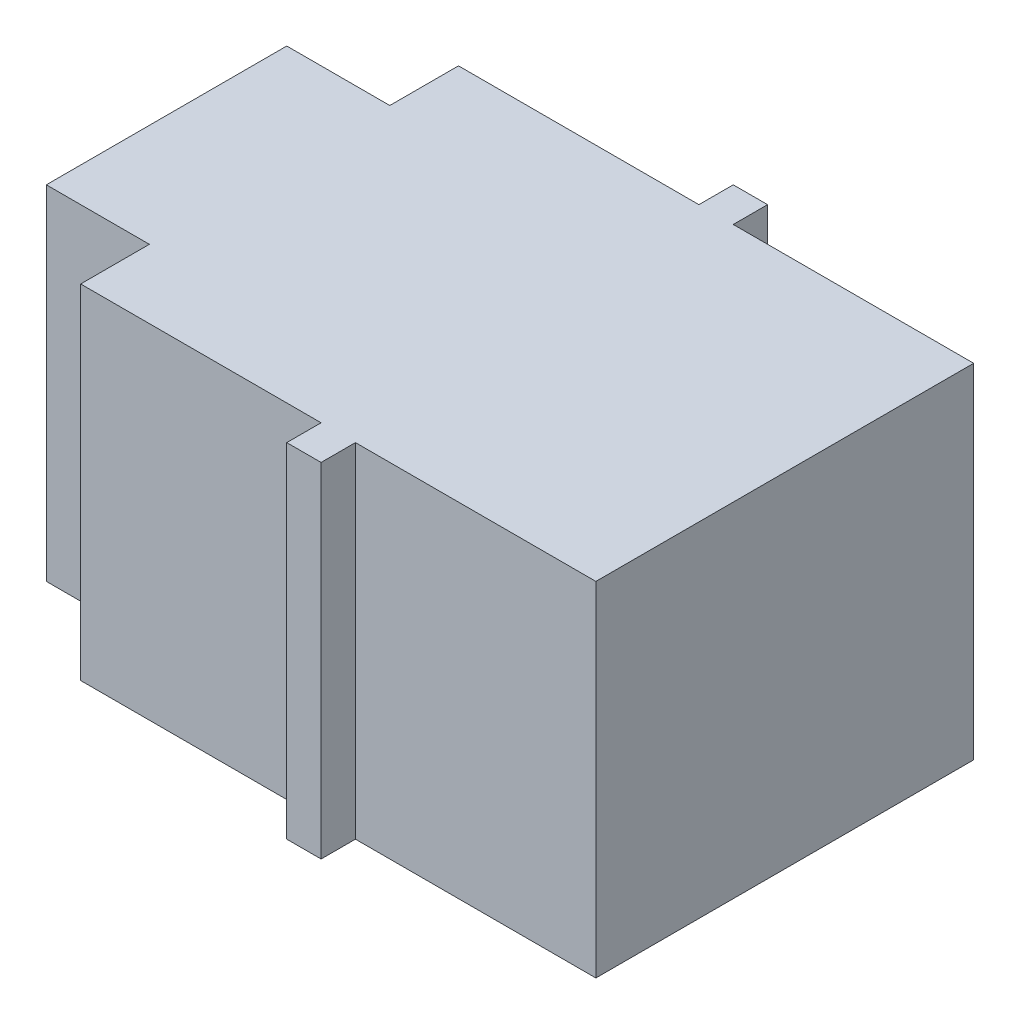
ISO-10303-21;
HEADER;
FILE_DESCRIPTION(('STEP AP214'),'2;1');
FILE_NAME('part.step','',(''),(''),'','','');
FILE_SCHEMA(('AUTOMOTIVE_DESIGN { 1 0 10303 214 1 1 1 1 }'));
ENDSEC;
DATA;
#1=APPLICATION_CONTEXT('core data for automotive mechanical design processes');
#2=APPLICATION_PROTOCOL_DEFINITION('international standard','automotive_design',2000,#1);
#3=PRODUCT_CONTEXT('',#1,'mechanical');
#4=PRODUCT('Part','Part','',(#3));
#5=PRODUCT_RELATED_PRODUCT_CATEGORY('part','',(#4));
#6=PRODUCT_DEFINITION_FORMATION('','',#4);
#7=PRODUCT_DEFINITION_CONTEXT('part definition',#1,'design');
#8=PRODUCT_DEFINITION('design','',#6,#7);
#9=PRODUCT_DEFINITION_SHAPE('','',#8);
#10=(LENGTH_UNIT() NAMED_UNIT(*) SI_UNIT(.MILLI.,.METRE.));
#11=(NAMED_UNIT(*) PLANE_ANGLE_UNIT() SI_UNIT($,.RADIAN.));
#12=(NAMED_UNIT(*) SI_UNIT($,.STERADIAN.) SOLID_ANGLE_UNIT());
#13=UNCERTAINTY_MEASURE_WITH_UNIT(LENGTH_MEASURE(1.E-05),#10,'distance_accuracy_value','');
#14=(GEOMETRIC_REPRESENTATION_CONTEXT(3) GLOBAL_UNCERTAINTY_ASSIGNED_CONTEXT((#13)) GLOBAL_UNIT_ASSIGNED_CONTEXT((#10,
#11,#12)) REPRESENTATION_CONTEXT('',''));
#15=CARTESIAN_POINT('',(0.,0.,0.));
#16=DIRECTION('',(0.,0.,1.));
#17=DIRECTION('',(1.,0.,0.));
#18=AXIS2_PLACEMENT_3D('',#15,#16,#17);
#19=CARTESIAN_POINT('',(-10.0287186852859,10.,3.5));
#20=DIRECTION('',(1.,0.,0.));
#21=DIRECTION('',(0.,0.,-1.));
#22=AXIS2_PLACEMENT_3D('',#19,#20,#21);
#23=PLANE('',#22);
#24=DIRECTION('',(0.,0.,1.));
#25=VECTOR('',#24,1.);
#26=CARTESIAN_POINT('',(-10.0287186852859,0.,3.5));
#27=LINE('',#26,#25);
#28=CARTESIAN_POINT('',(-10.0287186852859,0.,-3.5));
#29=VERTEX_POINT('',#28);
#30=CARTESIAN_POINT('',(-10.0287186852859,0.,3.5));
#31=VERTEX_POINT('',#30);
#32=EDGE_CURVE('E307',#29,#31,#27,.T.);
#33=ORIENTED_EDGE('',*,*,#32,.T.);
#34=DIRECTION('',(0.,-1.,0.));
#35=VECTOR('',#34,1.);
#36=CARTESIAN_POINT('',(-10.0287186852859,10.,3.5));
#37=LINE('',#36,#35);
#38=CARTESIAN_POINT('',(-10.0287186852859,10.,3.5));
#39=VERTEX_POINT('',#38);
#40=EDGE_CURVE('E337',#39,#31,#37,.T.);
#41=ORIENTED_EDGE('',*,*,#40,.F.);
#42=DIRECTION('',(0.,0.,1.));
#43=VECTOR('',#42,1.);
#44=CARTESIAN_POINT('',(-10.0287186852859,10.,3.5));
#45=LINE('',#44,#43);
#46=CARTESIAN_POINT('',(-10.0287186852859,10.,-3.5));
#47=VERTEX_POINT('',#46);
#48=EDGE_CURVE('E335',#47,#39,#45,.T.);
#49=ORIENTED_EDGE('',*,*,#48,.F.);
#50=DIRECTION('',(0.,-1.,0.));
#51=VECTOR('',#50,1.);
#52=CARTESIAN_POINT('',(-10.0287186852859,10.,-3.5));
#53=LINE('',#52,#51);
#54=EDGE_CURVE('E371',#47,#29,#53,.T.);
#55=ORIENTED_EDGE('',*,*,#54,.T.);
#56=EDGE_LOOP('',(#33,#41,#49,#55));
#57=FACE_BOUND('',#56,.T.);
#58=DIRECTION('',(0.,-1.,0.));
#59=VECTOR('',#58,1.);
#60=CARTESIAN_POINT('',(-10.0287186852859,0.,1.25));
#61=LINE('',#60,#59);
#62=CARTESIAN_POINT('',(-10.0287186852859,8.06407131922295,1.25));
#63=VERTEX_POINT('',#62);
#64=CARTESIAN_POINT('',(-10.0287186852859,3.13592868077706,1.25));
#65=VERTEX_POINT('',#64);
#66=EDGE_CURVE('E49',#63,#65,#61,.T.);
#67=ORIENTED_EDGE('',*,*,#66,.T.);
#68=CARTESIAN_POINT('',(-10.0287186852859,3.13592868077706,0.));
#69=DIRECTION('',(-1.,0.,0.));
#70=DIRECTION('',(0.,0.,1.));
#71=AXIS2_PLACEMENT_3D('',#68,#69,#70);
#72=CIRCLE('',#71,1.25);
#73=CARTESIAN_POINT('',(-10.0287186852859,3.13592868077706,-1.25));
#74=VERTEX_POINT('',#73);
#75=EDGE_CURVE('E236',#74,#65,#72,.T.);
#76=ORIENTED_EDGE('',*,*,#75,.F.);
#77=DIRECTION('',(0.,-1.,0.));
#78=VECTOR('',#77,1.);
#79=CARTESIAN_POINT('',(-10.0287186852859,0.,-1.25));
#80=LINE('',#79,#78);
#81=CARTESIAN_POINT('',(-10.0287186852859,8.06407131922294,-1.25));
#82=VERTEX_POINT('',#81);
#83=EDGE_CURVE('E222',#82,#74,#80,.T.);
#84=ORIENTED_EDGE('',*,*,#83,.F.);
#85=CARTESIAN_POINT('',(-10.0287186852859,8.06407131922294,0.));
#86=DIRECTION('',(-1.,0.,0.));
#87=DIRECTION('',(0.,0.,1.));
#88=AXIS2_PLACEMENT_3D('',#85,#86,#87);
#89=CIRCLE('',#88,1.25);
#90=EDGE_CURVE('E231',#63,#82,#89,.T.);
#91=ORIENTED_EDGE('',*,*,#90,.F.);
#92=EDGE_LOOP('',(#67,#76,#84,#91));
#93=FACE_BOUND('',#92,.T.);
#94=ADVANCED_FACE('F34',(#57,#93),#23,.F.);
#95=CARTESIAN_POINT('',(0.,10.,0.));
#96=DIRECTION('',(0.,-1.,0.));
#97=DIRECTION('',(0.,0.,-1.));
#98=AXIS2_PLACEMENT_3D('',#95,#96,#97);
#99=PLANE('',#98);
#100=DIRECTION('',(1.,0.,0.));
#101=VECTOR('',#100,1.);
#102=CARTESIAN_POINT('',(-10.0287186852859,10.,3.5));
#103=LINE('',#102,#101);
#104=CARTESIAN_POINT('',(-7.02871868528586,10.,3.5));
#105=VERTEX_POINT('',#104);
#106=EDGE_CURVE('E303',#39,#105,#103,.T.);
#107=ORIENTED_EDGE('',*,*,#106,.T.);
#108=DIRECTION('',(0.,0.,1.));
#109=VECTOR('',#108,1.);
#110=CARTESIAN_POINT('',(-7.02871868528586,10.,3.5));
#111=LINE('',#110,#109);
#112=CARTESIAN_POINT('',(-7.02871868528586,10.,5.5));
#113=VERTEX_POINT('',#112);
#114=EDGE_CURVE('E306',#105,#113,#111,.T.);
#115=ORIENTED_EDGE('',*,*,#114,.T.);
#116=DIRECTION('',(1.,0.,0.));
#117=VECTOR('',#116,1.);
#118=CARTESIAN_POINT('',(-7.02871868528586,10.,5.5));
#119=LINE('',#118,#117);
#120=CARTESIAN_POINT('',(-0.0287186852858581,10.,5.5));
#121=VERTEX_POINT('',#120);
#122=EDGE_CURVE('E309',#113,#121,#119,.T.);
#123=ORIENTED_EDGE('',*,*,#122,.T.);
#124=DIRECTION('',(0.,0.,1.));
#125=VECTOR('',#124,1.);
#126=CARTESIAN_POINT('',(-0.0287186852858581,10.,5.5));
#127=LINE('',#126,#125);
#128=CARTESIAN_POINT('',(-0.0287186852858584,10.,6.5));
#129=VERTEX_POINT('',#128);
#130=EDGE_CURVE('E311',#121,#129,#127,.T.);
#131=ORIENTED_EDGE('',*,*,#130,.T.);
#132=DIRECTION('',(1.,0.,0.));
#133=VECTOR('',#132,1.);
#134=CARTESIAN_POINT('',(-0.0287186852858584,10.,6.5));
#135=LINE('',#134,#133);
#136=CARTESIAN_POINT('',(0.971281314714142,10.,6.5));
#137=VERTEX_POINT('',#136);
#138=EDGE_CURVE('E313',#129,#137,#135,.T.);
#139=ORIENTED_EDGE('',*,*,#138,.T.);
#140=DIRECTION('',(0.,0.,-1.));
#141=VECTOR('',#140,1.);
#142=CARTESIAN_POINT('',(0.971281314714142,10.,6.5));
#143=LINE('',#142,#141);
#144=CARTESIAN_POINT('',(0.971281314714142,10.,5.5));
#145=VERTEX_POINT('',#144);
#146=EDGE_CURVE('E315',#137,#145,#143,.T.);
#147=ORIENTED_EDGE('',*,*,#146,.T.);
#148=DIRECTION('',(1.,0.,0.));
#149=VECTOR('',#148,1.);
#150=CARTESIAN_POINT('',(0.971281314714142,10.,5.5));
#151=LINE('',#150,#149);
#152=CARTESIAN_POINT('',(7.97128131471414,10.,5.5));
#153=VERTEX_POINT('',#152);
#154=EDGE_CURVE('E317',#145,#153,#151,.T.);
#155=ORIENTED_EDGE('',*,*,#154,.T.);
#156=DIRECTION('',(0.,0.,-1.));
#157=VECTOR('',#156,1.);
#158=CARTESIAN_POINT('',(7.97128131471414,10.,-5.5));
#159=LINE('',#158,#157);
#160=CARTESIAN_POINT('',(7.97128131471414,10.,-5.5));
#161=VERTEX_POINT('',#160);
#162=EDGE_CURVE('E319',#153,#161,#159,.T.);
#163=ORIENTED_EDGE('',*,*,#162,.T.);
#164=DIRECTION('',(-1.,0.,0.));
#165=VECTOR('',#164,1.);
#166=CARTESIAN_POINT('',(0.971281314714142,10.,-5.5));
#167=LINE('',#166,#165);
#168=CARTESIAN_POINT('',(0.971281314714142,10.,-5.5));
#169=VERTEX_POINT('',#168);
#170=EDGE_CURVE('E321',#161,#169,#167,.T.);
#171=ORIENTED_EDGE('',*,*,#170,.T.);
#172=DIRECTION('',(0.,0.,-1.));
#173=VECTOR('',#172,1.);
#174=CARTESIAN_POINT('',(0.971281314714142,10.,-6.5));
#175=LINE('',#174,#173);
#176=CARTESIAN_POINT('',(0.971281314714142,10.,-6.5));
#177=VERTEX_POINT('',#176);
#178=EDGE_CURVE('E323',#169,#177,#175,.T.);
#179=ORIENTED_EDGE('',*,*,#178,.T.);
#180=DIRECTION('',(-1.,0.,0.));
#181=VECTOR('',#180,1.);
#182=CARTESIAN_POINT('',(-0.0287186852858584,10.,-6.5));
#183=LINE('',#182,#181);
#184=CARTESIAN_POINT('',(-0.0287186852858584,10.,-6.5));
#185=VERTEX_POINT('',#184);
#186=EDGE_CURVE('E325',#177,#185,#183,.T.);
#187=ORIENTED_EDGE('',*,*,#186,.T.);
#188=DIRECTION('',(0.,0.,1.));
#189=VECTOR('',#188,1.);
#190=CARTESIAN_POINT('',(-0.0287186852858581,10.,-5.5));
#191=LINE('',#190,#189);
#192=CARTESIAN_POINT('',(-0.0287186852858581,10.,-5.5));
#193=VERTEX_POINT('',#192);
#194=EDGE_CURVE('E327',#185,#193,#191,.T.);
#195=ORIENTED_EDGE('',*,*,#194,.T.);
#196=DIRECTION('',(-1.,0.,0.));
#197=VECTOR('',#196,1.);
#198=CARTESIAN_POINT('',(-7.02871868528586,10.,-5.5));
#199=LINE('',#198,#197);
#200=CARTESIAN_POINT('',(-7.02871868528586,10.,-5.5));
#201=VERTEX_POINT('',#200);
#202=EDGE_CURVE('E329',#193,#201,#199,.T.);
#203=ORIENTED_EDGE('',*,*,#202,.T.);
#204=DIRECTION('',(0.,0.,1.));
#205=VECTOR('',#204,1.);
#206=CARTESIAN_POINT('',(-7.02871868528586,10.,-3.5));
#207=LINE('',#206,#205);
#208=CARTESIAN_POINT('',(-7.02871868528586,10.,-3.5));
#209=VERTEX_POINT('',#208);
#210=EDGE_CURVE('E331',#201,#209,#207,.T.);
#211=ORIENTED_EDGE('',*,*,#210,.T.);
#212=DIRECTION('',(-1.,0.,0.));
#213=VECTOR('',#212,1.);
#214=CARTESIAN_POINT('',(-10.0287186852859,10.,-3.5));
#215=LINE('',#214,#213);
#216=EDGE_CURVE('E333',#209,#47,#215,.T.);
#217=ORIENTED_EDGE('',*,*,#216,.T.);
#218=ORIENTED_EDGE('',*,*,#48,.T.);
#219=EDGE_LOOP('',(#107,#115,#123,#131,#139,#147,#155,#163,#171,#179,#187,#195,#203,#211,#217,#218));
#220=FACE_BOUND('',#219,.T.);
#221=ADVANCED_FACE('F439',(#220),#99,.F.);
#222=CARTESIAN_POINT('',(0.,0.,0.));
#223=DIRECTION('',(0.,-1.,0.));
#224=DIRECTION('',(0.,0.,-1.));
#225=AXIS2_PLACEMENT_3D('',#222,#223,#224);
#226=PLANE('',#225);
#227=DIRECTION('',(1.,0.,0.));
#228=VECTOR('',#227,1.);
#229=CARTESIAN_POINT('',(-10.0287186852859,0.,3.5));
#230=LINE('',#229,#228);
#231=CARTESIAN_POINT('',(-7.02871868528586,0.,3.5));
#232=VERTEX_POINT('',#231);
#233=EDGE_CURVE('E302',#31,#232,#230,.T.);
#234=ORIENTED_EDGE('',*,*,#233,.F.);
#235=ORIENTED_EDGE('',*,*,#32,.F.);
#236=DIRECTION('',(-1.,0.,0.));
#237=VECTOR('',#236,1.);
#238=CARTESIAN_POINT('',(-10.0287186852859,0.,-3.5));
#239=LINE('',#238,#237);
#240=CARTESIAN_POINT('',(-7.02871868528586,0.,-3.5));
#241=VERTEX_POINT('',#240);
#242=EDGE_CURVE('E366',#241,#29,#239,.T.);
#243=ORIENTED_EDGE('',*,*,#242,.F.);
#244=DIRECTION('',(0.,0.,1.));
#245=VECTOR('',#244,1.);
#246=CARTESIAN_POINT('',(-7.02871868528586,0.,-3.5));
#247=LINE('',#246,#245);
#248=CARTESIAN_POINT('',(-7.02871868528586,0.,-5.5));
#249=VERTEX_POINT('',#248);
#250=EDGE_CURVE('E364',#249,#241,#247,.T.);
#251=ORIENTED_EDGE('',*,*,#250,.F.);
#252=DIRECTION('',(-1.,0.,0.));
#253=VECTOR('',#252,1.);
#254=CARTESIAN_POINT('',(-7.02871868528586,0.,-5.5));
#255=LINE('',#254,#253);
#256=CARTESIAN_POINT('',(-0.0287186852858581,0.,-5.5));
#257=VERTEX_POINT('',#256);
#258=EDGE_CURVE('E362',#257,#249,#255,.T.);
#259=ORIENTED_EDGE('',*,*,#258,.F.);
#260=DIRECTION('',(0.,0.,1.));
#261=VECTOR('',#260,1.);
#262=CARTESIAN_POINT('',(-0.0287186852858581,0.,-5.5));
#263=LINE('',#262,#261);
#264=CARTESIAN_POINT('',(-0.0287186852858584,0.,-6.5));
#265=VERTEX_POINT('',#264);
#266=EDGE_CURVE('E360',#265,#257,#263,.T.);
#267=ORIENTED_EDGE('',*,*,#266,.F.);
#268=DIRECTION('',(-1.,0.,0.));
#269=VECTOR('',#268,1.);
#270=CARTESIAN_POINT('',(-0.0287186852858584,0.,-6.5));
#271=LINE('',#270,#269);
#272=CARTESIAN_POINT('',(0.971281314714142,0.,-6.5));
#273=VERTEX_POINT('',#272);
#274=EDGE_CURVE('E358',#273,#265,#271,.T.);
#275=ORIENTED_EDGE('',*,*,#274,.F.);
#276=DIRECTION('',(0.,0.,-1.));
#277=VECTOR('',#276,1.);
#278=CARTESIAN_POINT('',(0.971281314714142,0.,-6.5));
#279=LINE('',#278,#277);
#280=CARTESIAN_POINT('',(0.971281314714142,0.,-5.5));
#281=VERTEX_POINT('',#280);
#282=EDGE_CURVE('E356',#281,#273,#279,.T.);
#283=ORIENTED_EDGE('',*,*,#282,.F.);
#284=DIRECTION('',(-1.,0.,0.));
#285=VECTOR('',#284,1.);
#286=CARTESIAN_POINT('',(0.971281314714142,0.,-5.5));
#287=LINE('',#286,#285);
#288=CARTESIAN_POINT('',(7.97128131471414,0.,-5.5));
#289=VERTEX_POINT('',#288);
#290=EDGE_CURVE('E354',#289,#281,#287,.T.);
#291=ORIENTED_EDGE('',*,*,#290,.F.);
#292=DIRECTION('',(0.,0.,-1.));
#293=VECTOR('',#292,1.);
#294=CARTESIAN_POINT('',(7.97128131471414,0.,-5.5));
#295=LINE('',#294,#293);
#296=CARTESIAN_POINT('',(7.97128131471414,0.,5.5));
#297=VERTEX_POINT('',#296);
#298=EDGE_CURVE('E352',#297,#289,#295,.T.);
#299=ORIENTED_EDGE('',*,*,#298,.F.);
#300=DIRECTION('',(1.,0.,0.));
#301=VECTOR('',#300,1.);
#302=CARTESIAN_POINT('',(0.971281314714142,0.,5.5));
#303=LINE('',#302,#301);
#304=CARTESIAN_POINT('',(0.971281314714142,0.,5.5));
#305=VERTEX_POINT('',#304);
#306=EDGE_CURVE('E350',#305,#297,#303,.T.);
#307=ORIENTED_EDGE('',*,*,#306,.F.);
#308=DIRECTION('',(0.,0.,-1.));
#309=VECTOR('',#308,1.);
#310=CARTESIAN_POINT('',(0.971281314714142,0.,6.5));
#311=LINE('',#310,#309);
#312=CARTESIAN_POINT('',(0.971281314714142,0.,6.5));
#313=VERTEX_POINT('',#312);
#314=EDGE_CURVE('E348',#313,#305,#311,.T.);
#315=ORIENTED_EDGE('',*,*,#314,.F.);
#316=DIRECTION('',(1.,0.,0.));
#317=VECTOR('',#316,1.);
#318=CARTESIAN_POINT('',(-0.0287186852858584,0.,6.5));
#319=LINE('',#318,#317);
#320=CARTESIAN_POINT('',(-0.0287186852858584,0.,6.5));
#321=VERTEX_POINT('',#320);
#322=EDGE_CURVE('E346',#321,#313,#319,.T.);
#323=ORIENTED_EDGE('',*,*,#322,.F.);
#324=DIRECTION('',(0.,0.,1.));
#325=VECTOR('',#324,1.);
#326=CARTESIAN_POINT('',(-0.0287186852858581,0.,5.5));
#327=LINE('',#326,#325);
#328=CARTESIAN_POINT('',(-0.0287186852858581,0.,5.5));
#329=VERTEX_POINT('',#328);
#330=EDGE_CURVE('E344',#329,#321,#327,.T.);
#331=ORIENTED_EDGE('',*,*,#330,.F.);
#332=DIRECTION('',(1.,0.,0.));
#333=VECTOR('',#332,1.);
#334=CARTESIAN_POINT('',(-7.02871868528586,0.,5.5));
#335=LINE('',#334,#333);
#336=CARTESIAN_POINT('',(-7.02871868528586,0.,5.5));
#337=VERTEX_POINT('',#336);
#338=EDGE_CURVE('E342',#337,#329,#335,.T.);
#339=ORIENTED_EDGE('',*,*,#338,.F.);
#340=DIRECTION('',(0.,0.,1.));
#341=VECTOR('',#340,1.);
#342=CARTESIAN_POINT('',(-7.02871868528586,0.,3.5));
#343=LINE('',#342,#341);
#344=EDGE_CURVE('E340',#232,#337,#343,.T.);
#345=ORIENTED_EDGE('',*,*,#344,.F.);
#346=EDGE_LOOP('',(#234,#235,#243,#251,#259,#267,#275,#283,#291,#299,#307,#315,#323,#331,#339,#345));
#347=FACE_BOUND('',#346,.T.);
#348=ADVANCED_FACE('F445',(#347),#226,.T.);
#349=CARTESIAN_POINT('',(-10.0287186852859,10.,3.5));
#350=DIRECTION('',(0.,0.,-1.));
#351=DIRECTION('',(-1.,0.,0.));
#352=AXIS2_PLACEMENT_3D('',#349,#350,#351);
#353=PLANE('',#352);
#354=ORIENTED_EDGE('',*,*,#233,.T.);
#355=DIRECTION('',(0.,-1.,0.));
#356=VECTOR('',#355,1.);
#357=CARTESIAN_POINT('',(-7.02871868528586,10.,3.5));
#358=LINE('',#357,#356);
#359=EDGE_CURVE('E413',#105,#232,#358,.T.);
#360=ORIENTED_EDGE('',*,*,#359,.F.);
#361=ORIENTED_EDGE('',*,*,#106,.F.);
#362=ORIENTED_EDGE('',*,*,#40,.T.);
#363=EDGE_LOOP('',(#354,#360,#361,#362));
#364=FACE_BOUND('',#363,.T.);
#365=ADVANCED_FACE('F36',(#364),#353,.F.);
#366=CARTESIAN_POINT('',(-7.02871868528586,10.,3.5));
#367=DIRECTION('',(1.,0.,0.));
#368=DIRECTION('',(0.,0.,-1.));
#369=AXIS2_PLACEMENT_3D('',#366,#367,#368);
#370=PLANE('',#369);
#371=ORIENTED_EDGE('',*,*,#344,.T.);
#372=DIRECTION('',(0.,-1.,0.));
#373=VECTOR('',#372,1.);
#374=CARTESIAN_POINT('',(-7.02871868528586,10.,5.5));
#375=LINE('',#374,#373);
#376=EDGE_CURVE('E410',#113,#337,#375,.T.);
#377=ORIENTED_EDGE('',*,*,#376,.F.);
#378=ORIENTED_EDGE('',*,*,#114,.F.);
#379=ORIENTED_EDGE('',*,*,#359,.T.);
#380=EDGE_LOOP('',(#371,#377,#378,#379));
#381=FACE_BOUND('',#380,.T.);
#382=ADVANCED_FACE('F495',(#381),#370,.F.);
#383=CARTESIAN_POINT('',(-7.02871868528586,10.,5.5));
#384=DIRECTION('',(0.,0.,-1.));
#385=DIRECTION('',(-1.,0.,0.));
#386=AXIS2_PLACEMENT_3D('',#383,#384,#385);
#387=PLANE('',#386);
#388=ORIENTED_EDGE('',*,*,#338,.T.);
#389=DIRECTION('',(0.,-1.,0.));
#390=VECTOR('',#389,1.);
#391=CARTESIAN_POINT('',(-0.0287186852858581,10.,5.5));
#392=LINE('',#391,#390);
#393=EDGE_CURVE('E407',#121,#329,#392,.T.);
#394=ORIENTED_EDGE('',*,*,#393,.F.);
#395=ORIENTED_EDGE('',*,*,#122,.F.);
#396=ORIENTED_EDGE('',*,*,#376,.T.);
#397=EDGE_LOOP('',(#388,#394,#395,#396));
#398=FACE_BOUND('',#397,.T.);
#399=ADVANCED_FACE('F492',(#398),#387,.F.);
#400=CARTESIAN_POINT('',(-0.0287186852858581,10.,5.5));
#401=DIRECTION('',(1.,0.,0.));
#402=DIRECTION('',(0.,0.,-1.));
#403=AXIS2_PLACEMENT_3D('',#400,#401,#402);
#404=PLANE('',#403);
#405=ORIENTED_EDGE('',*,*,#330,.T.);
#406=DIRECTION('',(0.,-1.,0.));
#407=VECTOR('',#406,1.);
#408=CARTESIAN_POINT('',(-0.0287186852858584,10.,6.5));
#409=LINE('',#408,#407);
#410=EDGE_CURVE('E404',#129,#321,#409,.T.);
#411=ORIENTED_EDGE('',*,*,#410,.F.);
#412=ORIENTED_EDGE('',*,*,#130,.F.);
#413=ORIENTED_EDGE('',*,*,#393,.T.);
#414=EDGE_LOOP('',(#405,#411,#412,#413));
#415=FACE_BOUND('',#414,.T.);
#416=ADVANCED_FACE('F488',(#415),#404,.F.);
#417=CARTESIAN_POINT('',(-0.0287186852858584,10.,6.5));
#418=DIRECTION('',(0.,0.,-1.));
#419=DIRECTION('',(-1.,0.,0.));
#420=AXIS2_PLACEMENT_3D('',#417,#418,#419);
#421=PLANE('',#420);
#422=ORIENTED_EDGE('',*,*,#322,.T.);
#423=DIRECTION('',(0.,-1.,0.));
#424=VECTOR('',#423,1.);
#425=CARTESIAN_POINT('',(0.971281314714142,10.,6.5));
#426=LINE('',#425,#424);
#427=EDGE_CURVE('E401',#137,#313,#426,.T.);
#428=ORIENTED_EDGE('',*,*,#427,.F.);
#429=ORIENTED_EDGE('',*,*,#138,.F.);
#430=ORIENTED_EDGE('',*,*,#410,.T.);
#431=EDGE_LOOP('',(#422,#428,#429,#430));
#432=FACE_BOUND('',#431,.T.);
#433=ADVANCED_FACE('F484',(#432),#421,.F.);
#434=CARTESIAN_POINT('',(0.971281314714142,10.,6.5));
#435=DIRECTION('',(-1.,0.,0.));
#436=DIRECTION('',(0.,0.,1.));
#437=AXIS2_PLACEMENT_3D('',#434,#435,#436);
#438=PLANE('',#437);
#439=ORIENTED_EDGE('',*,*,#314,.T.);
#440=DIRECTION('',(0.,-1.,0.));
#441=VECTOR('',#440,1.);
#442=CARTESIAN_POINT('',(0.971281314714142,10.,5.5));
#443=LINE('',#442,#441);
#444=EDGE_CURVE('E398',#145,#305,#443,.T.);
#445=ORIENTED_EDGE('',*,*,#444,.F.);
#446=ORIENTED_EDGE('',*,*,#146,.F.);
#447=ORIENTED_EDGE('',*,*,#427,.T.);
#448=EDGE_LOOP('',(#439,#445,#446,#447));
#449=FACE_BOUND('',#448,.T.);
#450=ADVANCED_FACE('F480',(#449),#438,.F.);
#451=CARTESIAN_POINT('',(0.971281314714142,10.,5.5));
#452=DIRECTION('',(0.,0.,-1.));
#453=DIRECTION('',(-1.,0.,0.));
#454=AXIS2_PLACEMENT_3D('',#451,#452,#453);
#455=PLANE('',#454);
#456=ORIENTED_EDGE('',*,*,#306,.T.);
#457=DIRECTION('',(0.,-1.,0.));
#458=VECTOR('',#457,1.);
#459=CARTESIAN_POINT('',(7.97128131471414,10.,5.5));
#460=LINE('',#459,#458);
#461=EDGE_CURVE('E395',#153,#297,#460,.T.);
#462=ORIENTED_EDGE('',*,*,#461,.F.);
#463=ORIENTED_EDGE('',*,*,#154,.F.);
#464=ORIENTED_EDGE('',*,*,#444,.T.);
#465=EDGE_LOOP('',(#456,#462,#463,#464));
#466=FACE_BOUND('',#465,.T.);
#467=ADVANCED_FACE('F476',(#466),#455,.F.);
#468=CARTESIAN_POINT('',(7.97128131471414,10.,-5.5));
#469=DIRECTION('',(-1.,0.,0.));
#470=DIRECTION('',(0.,0.,1.));
#471=AXIS2_PLACEMENT_3D('',#468,#469,#470);
#472=PLANE('',#471);
#473=ORIENTED_EDGE('',*,*,#298,.T.);
#474=DIRECTION('',(0.,-1.,0.));
#475=VECTOR('',#474,1.);
#476=CARTESIAN_POINT('',(7.97128131471414,10.,-5.5));
#477=LINE('',#476,#475);
#478=EDGE_CURVE('E392',#161,#289,#477,.T.);
#479=ORIENTED_EDGE('',*,*,#478,.F.);
#480=ORIENTED_EDGE('',*,*,#162,.F.);
#481=ORIENTED_EDGE('',*,*,#461,.T.);
#482=EDGE_LOOP('',(#473,#479,#480,#481));
#483=FACE_BOUND('',#482,.T.);
#484=ADVANCED_FACE('F472',(#483),#472,.F.);
#485=CARTESIAN_POINT('',(0.971281314714142,10.,-5.5));
#486=DIRECTION('',(0.,0.,1.));
#487=DIRECTION('',(1.,0.,0.));
#488=AXIS2_PLACEMENT_3D('',#485,#486,#487);
#489=PLANE('',#488);
#490=ORIENTED_EDGE('',*,*,#290,.T.);
#491=DIRECTION('',(0.,-1.,0.));
#492=VECTOR('',#491,1.);
#493=CARTESIAN_POINT('',(0.971281314714142,10.,-5.5));
#494=LINE('',#493,#492);
#495=EDGE_CURVE('E389',#169,#281,#494,.T.);
#496=ORIENTED_EDGE('',*,*,#495,.F.);
#497=ORIENTED_EDGE('',*,*,#170,.F.);
#498=ORIENTED_EDGE('',*,*,#478,.T.);
#499=EDGE_LOOP('',(#490,#496,#497,#498));
#500=FACE_BOUND('',#499,.T.);
#501=ADVANCED_FACE('F468',(#500),#489,.F.);
#502=CARTESIAN_POINT('',(0.971281314714142,10.,-6.5));
#503=DIRECTION('',(-1.,0.,0.));
#504=DIRECTION('',(0.,0.,1.));
#505=AXIS2_PLACEMENT_3D('',#502,#503,#504);
#506=PLANE('',#505);
#507=ORIENTED_EDGE('',*,*,#282,.T.);
#508=DIRECTION('',(0.,-1.,0.));
#509=VECTOR('',#508,1.);
#510=CARTESIAN_POINT('',(0.971281314714142,10.,-6.5));
#511=LINE('',#510,#509);
#512=EDGE_CURVE('E386',#177,#273,#511,.T.);
#513=ORIENTED_EDGE('',*,*,#512,.F.);
#514=ORIENTED_EDGE('',*,*,#178,.F.);
#515=ORIENTED_EDGE('',*,*,#495,.T.);
#516=EDGE_LOOP('',(#507,#513,#514,#515));
#517=FACE_BOUND('',#516,.T.);
#518=ADVANCED_FACE('F464',(#517),#506,.F.);
#519=CARTESIAN_POINT('',(-0.0287186852858584,10.,-6.5));
#520=DIRECTION('',(0.,0.,1.));
#521=DIRECTION('',(1.,0.,0.));
#522=AXIS2_PLACEMENT_3D('',#519,#520,#521);
#523=PLANE('',#522);
#524=ORIENTED_EDGE('',*,*,#274,.T.);
#525=DIRECTION('',(0.,-1.,0.));
#526=VECTOR('',#525,1.);
#527=CARTESIAN_POINT('',(-0.0287186852858584,10.,-6.5));
#528=LINE('',#527,#526);
#529=EDGE_CURVE('E383',#185,#265,#528,.T.);
#530=ORIENTED_EDGE('',*,*,#529,.F.);
#531=ORIENTED_EDGE('',*,*,#186,.F.);
#532=ORIENTED_EDGE('',*,*,#512,.T.);
#533=EDGE_LOOP('',(#524,#530,#531,#532));
#534=FACE_BOUND('',#533,.T.);
#535=ADVANCED_FACE('F460',(#534),#523,.F.);
#536=CARTESIAN_POINT('',(-0.0287186852858581,10.,-5.5));
#537=DIRECTION('',(1.,0.,0.));
#538=DIRECTION('',(0.,0.,-1.));
#539=AXIS2_PLACEMENT_3D('',#536,#537,#538);
#540=PLANE('',#539);
#541=ORIENTED_EDGE('',*,*,#266,.T.);
#542=DIRECTION('',(0.,-1.,0.));
#543=VECTOR('',#542,1.);
#544=CARTESIAN_POINT('',(-0.0287186852858581,10.,-5.5));
#545=LINE('',#544,#543);
#546=EDGE_CURVE('E380',#193,#257,#545,.T.);
#547=ORIENTED_EDGE('',*,*,#546,.F.);
#548=ORIENTED_EDGE('',*,*,#194,.F.);
#549=ORIENTED_EDGE('',*,*,#529,.T.);
#550=EDGE_LOOP('',(#541,#547,#548,#549));
#551=FACE_BOUND('',#550,.T.);
#552=ADVANCED_FACE('F456',(#551),#540,.F.);
#553=CARTESIAN_POINT('',(-7.02871868528586,10.,-5.5));
#554=DIRECTION('',(0.,0.,1.));
#555=DIRECTION('',(1.,0.,0.));
#556=AXIS2_PLACEMENT_3D('',#553,#554,#555);
#557=PLANE('',#556);
#558=ORIENTED_EDGE('',*,*,#258,.T.);
#559=DIRECTION('',(0.,-1.,0.));
#560=VECTOR('',#559,1.);
#561=CARTESIAN_POINT('',(-7.02871868528586,10.,-5.5));
#562=LINE('',#561,#560);
#563=EDGE_CURVE('E377',#201,#249,#562,.T.);
#564=ORIENTED_EDGE('',*,*,#563,.F.);
#565=ORIENTED_EDGE('',*,*,#202,.F.);
#566=ORIENTED_EDGE('',*,*,#546,.T.);
#567=EDGE_LOOP('',(#558,#564,#565,#566));
#568=FACE_BOUND('',#567,.T.);
#569=ADVANCED_FACE('F452',(#568),#557,.F.);
#570=CARTESIAN_POINT('',(-7.02871868528586,10.,-3.5));
#571=DIRECTION('',(1.,0.,0.));
#572=DIRECTION('',(0.,0.,-1.));
#573=AXIS2_PLACEMENT_3D('',#570,#571,#572);
#574=PLANE('',#573);
#575=ORIENTED_EDGE('',*,*,#250,.T.);
#576=DIRECTION('',(0.,-1.,0.));
#577=VECTOR('',#576,1.);
#578=CARTESIAN_POINT('',(-7.02871868528586,10.,-3.5));
#579=LINE('',#578,#577);
#580=EDGE_CURVE('E374',#209,#241,#579,.T.);
#581=ORIENTED_EDGE('',*,*,#580,.F.);
#582=ORIENTED_EDGE('',*,*,#210,.F.);
#583=ORIENTED_EDGE('',*,*,#563,.T.);
#584=EDGE_LOOP('',(#575,#581,#582,#583));
#585=FACE_BOUND('',#584,.T.);
#586=ADVANCED_FACE('F433',(#585),#574,.F.);
#587=CARTESIAN_POINT('',(-10.0287186852859,10.,-3.5));
#588=DIRECTION('',(0.,0.,1.));
#589=DIRECTION('',(1.,0.,0.));
#590=AXIS2_PLACEMENT_3D('',#587,#588,#589);
#591=PLANE('',#590);
#592=ORIENTED_EDGE('',*,*,#242,.T.);
#593=ORIENTED_EDGE('',*,*,#54,.F.);
#594=ORIENTED_EDGE('',*,*,#216,.F.);
#595=ORIENTED_EDGE('',*,*,#580,.T.);
#596=EDGE_LOOP('',(#592,#593,#594,#595));
#597=FACE_BOUND('',#596,.T.);
#598=ADVANCED_FACE('F426',(#597),#591,.F.);
#599=CARTESIAN_POINT('',(-9.52871868528586,0.,1.25));
#600=DIRECTION('',(0.,0.,-1.));
#601=DIRECTION('',(0.,1.,0.));
#602=AXIS2_PLACEMENT_3D('',#599,#600,#601);
#603=PLANE('',#602);
#604=DIRECTION('',(-1.,0.,0.));
#605=VECTOR('',#604,1.);
#606=CARTESIAN_POINT('',(-9.52871868528586,3.13592868077706,1.25));
#607=LINE('',#606,#605);
#608=CARTESIAN_POINT('',(-9.82871868528586,3.13592868077706,1.25));
#609=VERTEX_POINT('',#608);
#610=EDGE_CURVE('E241',#609,#65,#607,.T.);
#611=ORIENTED_EDGE('',*,*,#610,.T.);
#612=ORIENTED_EDGE('',*,*,#66,.F.);
#613=DIRECTION('',(-1.,0.,0.));
#614=VECTOR('',#613,1.);
#615=CARTESIAN_POINT('',(-9.52871868528586,8.06407131922295,1.25));
#616=LINE('',#615,#614);
#617=CARTESIAN_POINT('',(-9.82871868528586,8.06407131922295,1.25));
#618=VERTEX_POINT('',#617);
#619=EDGE_CURVE('E228',#618,#63,#616,.T.);
#620=ORIENTED_EDGE('',*,*,#619,.F.);
#621=DIRECTION('',(0.,1.,0.));
#622=VECTOR('',#621,1.);
#623=CARTESIAN_POINT('',(-9.82871868528586,10.,1.25));
#624=LINE('',#623,#622);
#625=EDGE_CURVE('E11',#609,#618,#624,.T.);
#626=ORIENTED_EDGE('',*,*,#625,.F.);
#627=EDGE_LOOP('',(#611,#612,#620,#626));
#628=FACE_BOUND('',#627,.T.);
#629=ADVANCED_FACE('F424',(#628),#603,.T.);
#630=CARTESIAN_POINT('',(-9.52871868528586,3.13592868077706,0.));
#631=DIRECTION('',(-1.,0.,0.));
#632=DIRECTION('',(0.,0.,1.));
#633=AXIS2_PLACEMENT_3D('',#630,#631,#632);
#634=CYLINDRICAL_SURFACE('',#633,1.25);
#635=CARTESIAN_POINT('',(-9.82871868528586,3.13592868077706,0.));
#636=DIRECTION('',(1.,0.,0.));
#637=DIRECTION('',(0.,0.,-1.));
#638=AXIS2_PLACEMENT_3D('',#635,#636,#637);
#639=CIRCLE('',#638,1.25);
#640=CARTESIAN_POINT('',(-9.82871868528586,3.13592868077706,-1.25));
#641=VERTEX_POINT('',#640);
#642=EDGE_CURVE('E42',#609,#641,#639,.T.);
#643=ORIENTED_EDGE('',*,*,#642,.T.);
#644=DIRECTION('',(-1.,0.,0.));
#645=VECTOR('',#644,1.);
#646=CARTESIAN_POINT('',(-9.52871868528586,3.13592868077706,-1.25));
#647=LINE('',#646,#645);
#648=EDGE_CURVE('E227',#641,#74,#647,.T.);
#649=ORIENTED_EDGE('',*,*,#648,.T.);
#650=ORIENTED_EDGE('',*,*,#75,.T.);
#651=ORIENTED_EDGE('',*,*,#610,.F.);
#652=EDGE_LOOP('',(#643,#649,#650,#651));
#653=FACE_BOUND('',#652,.T.);
#654=ADVANCED_FACE('F421',(#653),#634,.F.);
#655=CARTESIAN_POINT('',(-9.52871868528586,0.,-1.25));
#656=DIRECTION('',(0.,0.,-1.));
#657=DIRECTION('',(0.,1.,0.));
#658=AXIS2_PLACEMENT_3D('',#655,#656,#657);
#659=PLANE('',#658);
#660=DIRECTION('',(0.,1.,0.));
#661=VECTOR('',#660,1.);
#662=CARTESIAN_POINT('',(-9.82871868528586,10.,-1.25));
#663=LINE('',#662,#661);
#664=CARTESIAN_POINT('',(-9.82871868528586,8.06407131922294,-1.25));
#665=VERTEX_POINT('',#664);
#666=EDGE_CURVE('E225',#641,#665,#663,.T.);
#667=ORIENTED_EDGE('',*,*,#666,.T.);
#668=DIRECTION('',(-1.,0.,0.));
#669=VECTOR('',#668,1.);
#670=CARTESIAN_POINT('',(-9.52871868528586,8.06407131922294,-1.25));
#671=LINE('',#670,#669);
#672=EDGE_CURVE('E57',#665,#82,#671,.T.);
#673=ORIENTED_EDGE('',*,*,#672,.T.);
#674=ORIENTED_EDGE('',*,*,#83,.T.);
#675=ORIENTED_EDGE('',*,*,#648,.F.);
#676=EDGE_LOOP('',(#667,#673,#674,#675));
#677=FACE_BOUND('',#676,.T.);
#678=ADVANCED_FACE('F219',(#677),#659,.F.);
#679=CARTESIAN_POINT('',(-9.52871868528586,8.06407131922294,0.));
#680=DIRECTION('',(-1.,0.,0.));
#681=DIRECTION('',(0.,0.,1.));
#682=AXIS2_PLACEMENT_3D('',#679,#680,#681);
#683=CYLINDRICAL_SURFACE('',#682,1.25);
#684=CARTESIAN_POINT('',(-9.82871868528586,8.06407131922294,0.));
#685=DIRECTION('',(1.,0.,0.));
#686=DIRECTION('',(0.,0.,-1.));
#687=AXIS2_PLACEMENT_3D('',#684,#685,#686);
#688=CIRCLE('',#687,1.25);
#689=EDGE_CURVE('E416',#665,#618,#688,.T.);
#690=ORIENTED_EDGE('',*,*,#689,.T.);
#691=ORIENTED_EDGE('',*,*,#619,.T.);
#692=ORIENTED_EDGE('',*,*,#90,.T.);
#693=ORIENTED_EDGE('',*,*,#672,.F.);
#694=EDGE_LOOP('',(#690,#691,#692,#693));
#695=FACE_BOUND('',#694,.T.);
#696=ADVANCED_FACE('F232',(#695),#683,.F.);
#697=CARTESIAN_POINT('',(-9.82871868528586,10.,3.3));
#698=DIRECTION('',(1.,0.,0.));
#699=DIRECTION('',(0.,0.,-1.));
#700=AXIS2_PLACEMENT_3D('',#697,#698,#699);
#701=PLANE('',#700);
#702=DIRECTION('',(0.,-1.,0.));
#703=VECTOR('',#702,1.);
#704=CARTESIAN_POINT('',(-9.82871868528586,10.,-3.3));
#705=LINE('',#704,#703);
#706=CARTESIAN_POINT('',(-9.82871868528586,9.8,-3.3));
#707=VERTEX_POINT('',#706);
#708=CARTESIAN_POINT('',(-9.82871868528586,0.2,-3.3));
#709=VERTEX_POINT('',#708);
#710=EDGE_CURVE('E298',#707,#709,#705,.T.);
#711=ORIENTED_EDGE('',*,*,#710,.F.);
#712=DIRECTION('',(0.,0.,1.));
#713=VECTOR('',#712,1.);
#714=CARTESIAN_POINT('',(-9.82871868528586,9.8,0.));
#715=LINE('',#714,#713);
#716=CARTESIAN_POINT('',(-9.82871868528586,9.8,3.3));
#717=VERTEX_POINT('',#716);
#718=EDGE_CURVE('E256',#707,#717,#715,.T.);
#719=ORIENTED_EDGE('',*,*,#718,.T.);
#720=DIRECTION('',(0.,-1.,0.));
#721=VECTOR('',#720,1.);
#722=CARTESIAN_POINT('',(-9.82871868528586,10.,3.3));
#723=LINE('',#722,#721);
#724=CARTESIAN_POINT('',(-9.82871868528586,0.2,3.3));
#725=VERTEX_POINT('',#724);
#726=EDGE_CURVE('E296',#717,#725,#723,.T.);
#727=ORIENTED_EDGE('',*,*,#726,.T.);
#728=DIRECTION('',(0.,0.,1.));
#729=VECTOR('',#728,1.);
#730=CARTESIAN_POINT('',(-9.82871868528586,0.2,0.));
#731=LINE('',#730,#729);
#732=EDGE_CURVE('E274',#709,#725,#731,.T.);
#733=ORIENTED_EDGE('',*,*,#732,.F.);
#734=EDGE_LOOP('',(#711,#719,#727,#733));
#735=FACE_BOUND('',#734,.T.);
#736=ORIENTED_EDGE('',*,*,#642,.F.);
#737=ORIENTED_EDGE('',*,*,#625,.T.);
#738=ORIENTED_EDGE('',*,*,#689,.F.);
#739=ORIENTED_EDGE('',*,*,#666,.F.);
#740=EDGE_LOOP('',(#736,#737,#738,#739));
#741=FACE_BOUND('',#740,.T.);
#742=ADVANCED_FACE('F423',(#735,#741),#701,.T.);
#743=CARTESIAN_POINT('',(0.,9.8,0.));
#744=DIRECTION('',(0.,1.,0.));
#745=DIRECTION('',(0.,0.,1.));
#746=AXIS2_PLACEMENT_3D('',#743,#744,#745);
#747=PLANE('',#746);
#748=DIRECTION('',(0.,0.,1.));
#749=VECTOR('',#748,1.);
#750=CARTESIAN_POINT('',(7.77128131471414,9.8,0.));
#751=LINE('',#750,#749);
#752=CARTESIAN_POINT('',(7.77128131471414,9.8,-5.3));
#753=VERTEX_POINT('',#752);
#754=CARTESIAN_POINT('',(7.77128131471414,9.8,5.3));
#755=VERTEX_POINT('',#754);
#756=EDGE_CURVE('E243',#753,#755,#751,.T.);
#757=ORIENTED_EDGE('',*,*,#756,.T.);
#758=DIRECTION('',(1.,0.,0.));
#759=VECTOR('',#758,1.);
#760=CARTESIAN_POINT('',(0.,9.8,5.3));
#761=LINE('',#760,#759);
#762=CARTESIAN_POINT('',(-6.82871868528586,9.8,5.3));
#763=VERTEX_POINT('',#762);
#764=EDGE_CURVE('E261',#763,#755,#761,.T.);
#765=ORIENTED_EDGE('',*,*,#764,.F.);
#766=DIRECTION('',(0.,0.,1.));
#767=VECTOR('',#766,1.);
#768=CARTESIAN_POINT('',(-6.82871868528586,9.8,0.));
#769=LINE('',#768,#767);
#770=CARTESIAN_POINT('',(-6.82871868528586,9.8,3.3));
#771=VERTEX_POINT('',#770);
#772=EDGE_CURVE('E253',#771,#763,#769,.T.);
#773=ORIENTED_EDGE('',*,*,#772,.F.);
#774=DIRECTION('',(-1.,0.,0.));
#775=VECTOR('',#774,1.);
#776=CARTESIAN_POINT('',(0.,9.8,3.3));
#777=LINE('',#776,#775);
#778=EDGE_CURVE('E259',#771,#717,#777,.T.);
#779=ORIENTED_EDGE('',*,*,#778,.T.);
#780=ORIENTED_EDGE('',*,*,#718,.F.);
#781=DIRECTION('',(-1.,0.,0.));
#782=VECTOR('',#781,1.);
#783=CARTESIAN_POINT('',(0.,9.8,-3.3));
#784=LINE('',#783,#782);
#785=CARTESIAN_POINT('',(-6.82871868528586,9.8,-3.3));
#786=VERTEX_POINT('',#785);
#787=EDGE_CURVE('E252',#786,#707,#784,.T.);
#788=ORIENTED_EDGE('',*,*,#787,.F.);
#789=CARTESIAN_POINT('',(-6.82871868528586,9.8,-5.3));
#790=VERTEX_POINT('',#789);
#791=EDGE_CURVE('E249',#790,#786,#769,.T.);
#792=ORIENTED_EDGE('',*,*,#791,.F.);
#793=DIRECTION('',(1.,0.,0.));
#794=VECTOR('',#793,1.);
#795=CARTESIAN_POINT('',(0.,9.8,-5.3));
#796=LINE('',#795,#794);
#797=EDGE_CURVE('E247',#790,#753,#796,.T.);
#798=ORIENTED_EDGE('',*,*,#797,.T.);
#799=EDGE_LOOP('',(#757,#765,#773,#779,#780,#788,#792,#798));
#800=FACE_BOUND('',#799,.T.);
#801=ADVANCED_FACE('F662',(#800),#747,.F.);
#802=CARTESIAN_POINT('',(0.,0.2,0.));
#803=DIRECTION('',(0.,-1.,0.));
#804=DIRECTION('',(0.,0.,-1.));
#805=AXIS2_PLACEMENT_3D('',#802,#803,#804);
#806=PLANE('',#805);
#807=DIRECTION('',(-1.,0.,0.));
#808=VECTOR('',#807,1.);
#809=CARTESIAN_POINT('',(0.,0.2,5.3));
#810=LINE('',#809,#808);
#811=CARTESIAN_POINT('',(7.77128131471414,0.2,5.3));
#812=VERTEX_POINT('',#811);
#813=CARTESIAN_POINT('',(-6.82871868528586,0.2,5.3));
#814=VERTEX_POINT('',#813);
#815=EDGE_CURVE('E264',#812,#814,#810,.T.);
#816=ORIENTED_EDGE('',*,*,#815,.F.);
#817=DIRECTION('',(0.,0.,-1.));
#818=VECTOR('',#817,1.);
#819=CARTESIAN_POINT('',(7.77128131471414,0.2,0.));
#820=LINE('',#819,#818);
#821=CARTESIAN_POINT('',(7.77128131471414,0.200000000000001,-5.3));
#822=VERTEX_POINT('',#821);
#823=EDGE_CURVE('E283',#812,#822,#820,.T.);
#824=ORIENTED_EDGE('',*,*,#823,.T.);
#825=DIRECTION('',(-1.,0.,0.));
#826=VECTOR('',#825,1.);
#827=CARTESIAN_POINT('',(0.,0.2,-5.3));
#828=LINE('',#827,#826);
#829=CARTESIAN_POINT('',(-6.82871868528586,0.2,-5.3));
#830=VERTEX_POINT('',#829);
#831=EDGE_CURVE('E280',#822,#830,#828,.T.);
#832=ORIENTED_EDGE('',*,*,#831,.T.);
#833=DIRECTION('',(0.,0.,-1.));
#834=VECTOR('',#833,1.);
#835=CARTESIAN_POINT('',(-6.82871868528586,0.2,0.));
#836=LINE('',#835,#834);
#837=CARTESIAN_POINT('',(-6.82871868528586,0.2,-3.3));
#838=VERTEX_POINT('',#837);
#839=EDGE_CURVE('E271',#838,#830,#836,.T.);
#840=ORIENTED_EDGE('',*,*,#839,.F.);
#841=DIRECTION('',(-1.,0.,0.));
#842=VECTOR('',#841,1.);
#843=CARTESIAN_POINT('',(0.,0.2,-3.3));
#844=LINE('',#843,#842);
#845=EDGE_CURVE('E277',#838,#709,#844,.T.);
#846=ORIENTED_EDGE('',*,*,#845,.T.);
#847=ORIENTED_EDGE('',*,*,#732,.T.);
#848=DIRECTION('',(-1.,0.,0.));
#849=VECTOR('',#848,1.);
#850=CARTESIAN_POINT('',(0.,0.2,3.3));
#851=LINE('',#850,#849);
#852=CARTESIAN_POINT('',(-6.82871868528586,0.2,3.3));
#853=VERTEX_POINT('',#852);
#854=EDGE_CURVE('E270',#853,#725,#851,.T.);
#855=ORIENTED_EDGE('',*,*,#854,.F.);
#856=EDGE_CURVE('E267',#814,#853,#836,.T.);
#857=ORIENTED_EDGE('',*,*,#856,.F.);
#858=EDGE_LOOP('',(#816,#824,#832,#840,#846,#847,#855,#857));
#859=FACE_BOUND('',#858,.T.);
#860=ADVANCED_FACE('F656',(#859),#806,.F.);
#861=CARTESIAN_POINT('',(-6.82871868528586,10.,-5.3));
#862=DIRECTION('',(0.,0.,1.));
#863=DIRECTION('',(1.,0.,0.));
#864=AXIS2_PLACEMENT_3D('',#861,#862,#863);
#865=PLANE('',#864);
#866=DIRECTION('',(0.,-1.,0.));
#867=VECTOR('',#866,1.);
#868=CARTESIAN_POINT('',(7.77128131471414,10.,-5.3));
#869=LINE('',#868,#867);
#870=EDGE_CURVE('E288',#753,#822,#869,.T.);
#871=ORIENTED_EDGE('',*,*,#870,.F.);
#872=ORIENTED_EDGE('',*,*,#797,.F.);
#873=DIRECTION('',(0.,-1.,0.));
#874=VECTOR('',#873,1.);
#875=CARTESIAN_POINT('',(-6.82871868528586,10.,-5.3));
#876=LINE('',#875,#874);
#877=EDGE_CURVE('E286',#790,#830,#876,.T.);
#878=ORIENTED_EDGE('',*,*,#877,.T.);
#879=ORIENTED_EDGE('',*,*,#831,.F.);
#880=EDGE_LOOP('',(#871,#872,#878,#879));
#881=FACE_BOUND('',#880,.T.);
#882=ADVANCED_FACE('F661',(#881),#865,.T.);
#883=CARTESIAN_POINT('',(7.77128131471414,10.,-5.3));
#884=DIRECTION('',(-1.,0.,0.));
#885=DIRECTION('',(0.,0.,1.));
#886=AXIS2_PLACEMENT_3D('',#883,#884,#885);
#887=PLANE('',#886);
#888=DIRECTION('',(0.,-1.,0.));
#889=VECTOR('',#888,1.);
#890=CARTESIAN_POINT('',(7.77128131471414,10.,5.3));
#891=LINE('',#890,#889);
#892=EDGE_CURVE('E290',#755,#812,#891,.T.);
#893=ORIENTED_EDGE('',*,*,#892,.F.);
#894=ORIENTED_EDGE('',*,*,#756,.F.);
#895=ORIENTED_EDGE('',*,*,#870,.T.);
#896=ORIENTED_EDGE('',*,*,#823,.F.);
#897=EDGE_LOOP('',(#893,#894,#895,#896));
#898=FACE_BOUND('',#897,.T.);
#899=ADVANCED_FACE('F673',(#898),#887,.T.);
#900=CARTESIAN_POINT('',(0.771281314714142,10.,5.3));
#901=DIRECTION('',(0.,0.,-1.));
#902=DIRECTION('',(-1.,0.,0.));
#903=AXIS2_PLACEMENT_3D('',#900,#901,#902);
#904=PLANE('',#903);
#905=DIRECTION('',(0.,-1.,0.));
#906=VECTOR('',#905,1.);
#907=CARTESIAN_POINT('',(-6.82871868528586,10.,5.3));
#908=LINE('',#907,#906);
#909=EDGE_CURVE('E292',#763,#814,#908,.T.);
#910=ORIENTED_EDGE('',*,*,#909,.F.);
#911=ORIENTED_EDGE('',*,*,#764,.T.);
#912=ORIENTED_EDGE('',*,*,#892,.T.);
#913=ORIENTED_EDGE('',*,*,#815,.T.);
#914=EDGE_LOOP('',(#910,#911,#912,#913));
#915=FACE_BOUND('',#914,.T.);
#916=ADVANCED_FACE('F690',(#915),#904,.T.);
#917=CARTESIAN_POINT('',(-6.82871868528586,10.,3.3));
#918=DIRECTION('',(1.,0.,0.));
#919=DIRECTION('',(0.,0.,-1.));
#920=AXIS2_PLACEMENT_3D('',#917,#918,#919);
#921=PLANE('',#920);
#922=DIRECTION('',(0.,-1.,0.));
#923=VECTOR('',#922,1.);
#924=CARTESIAN_POINT('',(-6.82871868528586,10.,3.3));
#925=LINE('',#924,#923);
#926=EDGE_CURVE('E294',#771,#853,#925,.T.);
#927=ORIENTED_EDGE('',*,*,#926,.F.);
#928=ORIENTED_EDGE('',*,*,#772,.T.);
#929=ORIENTED_EDGE('',*,*,#909,.T.);
#930=ORIENTED_EDGE('',*,*,#856,.T.);
#931=EDGE_LOOP('',(#927,#928,#929,#930));
#932=FACE_BOUND('',#931,.T.);
#933=ADVANCED_FACE('F699',(#932),#921,.T.);
#934=CARTESIAN_POINT('',(-9.82871868528586,10.,3.3));
#935=DIRECTION('',(0.,0.,-1.));
#936=DIRECTION('',(-1.,0.,0.));
#937=AXIS2_PLACEMENT_3D('',#934,#935,#936);
#938=PLANE('',#937);
#939=ORIENTED_EDGE('',*,*,#726,.F.);
#940=ORIENTED_EDGE('',*,*,#778,.F.);
#941=ORIENTED_EDGE('',*,*,#926,.T.);
#942=ORIENTED_EDGE('',*,*,#854,.T.);
#943=EDGE_LOOP('',(#939,#940,#941,#942));
#944=FACE_BOUND('',#943,.T.);
#945=ADVANCED_FACE('F714',(#944),#938,.T.);
#946=CARTESIAN_POINT('',(-9.82871868528586,10.,-3.3));
#947=DIRECTION('',(0.,0.,1.));
#948=DIRECTION('',(1.,0.,0.));
#949=AXIS2_PLACEMENT_3D('',#946,#947,#948);
#950=PLANE('',#949);
#951=DIRECTION('',(0.,-1.,0.));
#952=VECTOR('',#951,1.);
#953=CARTESIAN_POINT('',(-6.82871868528586,10.,-3.3));
#954=LINE('',#953,#952);
#955=EDGE_CURVE('E300',#786,#838,#954,.T.);
#956=ORIENTED_EDGE('',*,*,#955,.F.);
#957=ORIENTED_EDGE('',*,*,#787,.T.);
#958=ORIENTED_EDGE('',*,*,#710,.T.);
#959=ORIENTED_EDGE('',*,*,#845,.F.);
#960=EDGE_LOOP('',(#956,#957,#958,#959));
#961=FACE_BOUND('',#960,.T.);
#962=ADVANCED_FACE('F723',(#961),#950,.T.);
#963=CARTESIAN_POINT('',(-6.82871868528586,10.,-3.3));
#964=DIRECTION('',(1.,0.,0.));
#965=DIRECTION('',(0.,0.,-1.));
#966=AXIS2_PLACEMENT_3D('',#963,#964,#965);
#967=PLANE('',#966);
#968=ORIENTED_EDGE('',*,*,#877,.F.);
#969=ORIENTED_EDGE('',*,*,#791,.T.);
#970=ORIENTED_EDGE('',*,*,#955,.T.);
#971=ORIENTED_EDGE('',*,*,#839,.T.);
#972=EDGE_LOOP('',(#968,#969,#970,#971));
#973=FACE_BOUND('',#972,.T.);
#974=ADVANCED_FACE('F732',(#973),#967,.T.);
#975=CLOSED_SHELL('',(#94,#221,#348,#365,#382,#399,#416,#433,#450,#467,#484,#501,#518,#535,#552,
#569,#586,#598,#629,#654,#678,#696,#742,#801,#860,#882,#899,#916,#933,#945,#962,#974));
#976=MANIFOLD_SOLID_BREP('B2',#975);
#977=ADVANCED_BREP_SHAPE_REPRESENTATION('',(#18,#976),#14);
#978=SHAPE_DEFINITION_REPRESENTATION(#9,#977);
ENDSEC;
END-ISO-10303-21;
